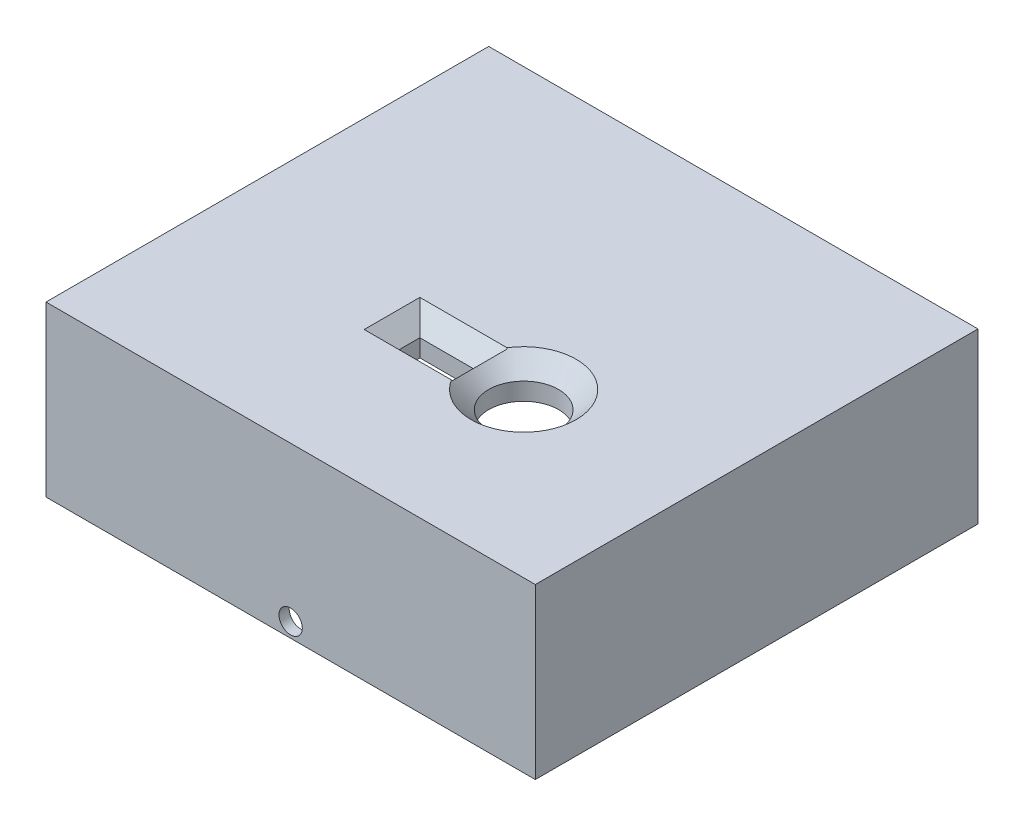
ISO-10303-21;
HEADER;
FILE_DESCRIPTION(('STEP AP214'),'2;1');
FILE_NAME('part.step','',(''),(''),'','','');
FILE_SCHEMA(('AUTOMOTIVE_DESIGN { 1 0 10303 214 1 1 1 1 }'));
ENDSEC;
DATA;
#1=APPLICATION_CONTEXT('core data for automotive mechanical design processes');
#2=APPLICATION_PROTOCOL_DEFINITION('international standard','automotive_design',2000,#1);
#3=PRODUCT_CONTEXT('',#1,'mechanical');
#4=PRODUCT('Part','Part','',(#3));
#5=PRODUCT_RELATED_PRODUCT_CATEGORY('part','',(#4));
#6=PRODUCT_DEFINITION_FORMATION('','',#4);
#7=PRODUCT_DEFINITION_CONTEXT('part definition',#1,'design');
#8=PRODUCT_DEFINITION('design','',#6,#7);
#9=PRODUCT_DEFINITION_SHAPE('','',#8);
#10=(LENGTH_UNIT() NAMED_UNIT(*) SI_UNIT(.MILLI.,.METRE.));
#11=(NAMED_UNIT(*) PLANE_ANGLE_UNIT() SI_UNIT($,.RADIAN.));
#12=(NAMED_UNIT(*) SI_UNIT($,.STERADIAN.) SOLID_ANGLE_UNIT());
#13=UNCERTAINTY_MEASURE_WITH_UNIT(LENGTH_MEASURE(1.E-05),#10,'distance_accuracy_value','');
#14=(GEOMETRIC_REPRESENTATION_CONTEXT(3) GLOBAL_UNCERTAINTY_ASSIGNED_CONTEXT((#13)) GLOBAL_UNIT_ASSIGNED_CONTEXT((#10,
#11,#12)) REPRESENTATION_CONTEXT('',''));
#15=CARTESIAN_POINT('',(0.,0.,0.));
#16=DIRECTION('',(0.,0.,1.));
#17=DIRECTION('',(1.,0.,0.));
#18=AXIS2_PLACEMENT_3D('',#15,#16,#17);
#19=CARTESIAN_POINT('',(0.,17.2171639290973,0.));
#20=DIRECTION('',(0.,1.,0.));
#21=DIRECTION('',(0.,0.,1.));
#22=AXIS2_PLACEMENT_3D('',#19,#20,#21);
#23=PLANE('',#22);
#24=DIRECTION('',(0.,0.,-1.));
#25=VECTOR('',#24,1.);
#26=CARTESIAN_POINT('',(-31.7595631136323,17.2171639290973,40.0823430767128));
#27=LINE('',#26,#25);
#28=CARTESIAN_POINT('',(-31.7595631136323,17.2171639290973,38.0823430767128));
#29=VERTEX_POINT('',#28);
#30=CARTESIAN_POINT('',(-31.7595631136323,17.2171639290973,26.2063778767126));
#31=VERTEX_POINT('',#30);
#32=EDGE_CURVE('E319',#29,#31,#27,.T.);
#33=ORIENTED_EDGE('',*,*,#32,.T.);
#34=DIRECTION('',(1.,0.,0.));
#35=VECTOR('',#34,1.);
#36=CARTESIAN_POINT('',(-30.0095631136323,17.2171639290973,26.2063778767126));
#37=LINE('',#36,#35);
#38=CARTESIAN_POINT('',(-30.0095631136323,17.2171639290973,26.2063778767126));
#39=VERTEX_POINT('',#38);
#40=EDGE_CURVE('E1033',#31,#39,#37,.T.);
#41=ORIENTED_EDGE('',*,*,#40,.T.);
#42=DIRECTION('',(0.,0.,-1.));
#43=VECTOR('',#42,1.);
#44=CARTESIAN_POINT('',(-30.0095631136323,17.2171639290973,52.3943564767127));
#45=LINE('',#44,#43);
#46=CARTESIAN_POINT('',(-30.0095631136323,17.2171639290973,-20.1056435232873));
#47=VERTEX_POINT('',#46);
#48=EDGE_CURVE('E373',#39,#47,#45,.T.);
#49=ORIENTED_EDGE('',*,*,#48,.T.);
#50=DIRECTION('',(1.,0.,0.));
#51=VECTOR('',#50,1.);
#52=CARTESIAN_POINT('',(-30.0095631136323,17.2171639290973,-20.1056435232873));
#53=LINE('',#52,#51);
#54=CARTESIAN_POINT('',(50.4902968863677,17.2171639290973,-20.1056435232873));
#55=VERTEX_POINT('',#54);
#56=EDGE_CURVE('E377',#47,#55,#53,.T.);
#57=ORIENTED_EDGE('',*,*,#56,.T.);
#58=DIRECTION('',(0.,0.,1.));
#59=VECTOR('',#58,1.);
#60=CARTESIAN_POINT('',(50.4902968863677,17.2171639290973,52.3943564767127));
#61=LINE('',#60,#59);
#62=CARTESIAN_POINT('',(50.4902968863677,17.2171639290973,52.3943564767127));
#63=VERTEX_POINT('',#62);
#64=EDGE_CURVE('E381',#55,#63,#61,.T.);
#65=ORIENTED_EDGE('',*,*,#64,.T.);
#66=DIRECTION('',(-1.,0.,0.));
#67=VECTOR('',#66,1.);
#68=CARTESIAN_POINT('',(-30.0095631136323,17.2171639290973,52.3943564767127));
#69=LINE('',#68,#67);
#70=CARTESIAN_POINT('',(-30.0095631136323,17.2171639290973,52.3943564767127));
#71=VERTEX_POINT('',#70);
#72=EDGE_CURVE('E369',#63,#71,#69,.T.);
#73=ORIENTED_EDGE('',*,*,#72,.T.);
#74=CARTESIAN_POINT('',(-30.0095631136323,17.2171639290973,38.0823430767128));
#75=VERTEX_POINT('',#74);
#76=EDGE_CURVE('E374',#71,#75,#45,.T.);
#77=ORIENTED_EDGE('',*,*,#76,.T.);
#78=DIRECTION('',(-1.,0.,0.));
#79=VECTOR('',#78,1.);
#80=CARTESIAN_POINT('',(-31.7595631136323,17.2171639290973,38.0823430767128));
#81=LINE('',#80,#79);
#82=EDGE_CURVE('E1030',#75,#29,#81,.T.);
#83=ORIENTED_EDGE('',*,*,#82,.T.);
#84=EDGE_LOOP('',(#33,#41,#49,#57,#65,#73,#77,#83));
#85=FACE_BOUND('',#84,.T.);
#86=CARTESIAN_POINT('',(22.2403298776787,17.2171639290973,26.1443623216558));
#87=DIRECTION('',(0.,-1.,0.));
#88=DIRECTION('',(0.,0.,-1.));
#89=AXIS2_PLACEMENT_3D('',#86,#87,#88);
#90=CIRCLE('',#89,8.);
#91=CARTESIAN_POINT('',(20.6486427168637,17.2171639290973,18.3043028842473));
#92=VERTEX_POINT('',#91);
#93=CARTESIAN_POINT('',(20.6486025662581,17.2171639290973,33.9844136075899));
#94=VERTEX_POINT('',#93);
#95=EDGE_CURVE('E257',#92,#94,#90,.T.);
#96=ORIENTED_EDGE('',*,*,#95,.F.);
#97=DIRECTION('',(0.980007429676051,0.,-0.198960895101874));
#98=VECTOR('',#97,1.);
#99=CARTESIAN_POINT('',(0.64039748636765,17.2171639290973,22.3663724767128));
#100=LINE('',#99,#98);
#101=CARTESIAN_POINT('',(0.64039748636765,17.2171639290973,22.3663724767128));
#102=VERTEX_POINT('',#101);
#103=EDGE_CURVE('E263',#102,#92,#100,.T.);
#104=ORIENTED_EDGE('',*,*,#103,.F.);
#105=DIRECTION('',(0.,0.,-1.));
#106=VECTOR('',#105,1.);
#107=CARTESIAN_POINT('',(0.64039748636765,17.2171639290973,29.9222454767128));
#108=LINE('',#107,#106);
#109=CARTESIAN_POINT('',(0.64039748636765,17.2171639290973,29.9222454767128));
#110=VERTEX_POINT('',#109);
#111=EDGE_CURVE('E280',#110,#102,#108,.T.);
#112=ORIENTED_EDGE('',*,*,#111,.F.);
#113=DIRECTION('',(-0.980006410741771,0.,-0.198965913927564));
#114=VECTOR('',#113,1.);
#115=CARTESIAN_POINT('',(0.64039748636765,17.2171639290973,29.9222454767128));
#116=LINE('',#115,#114);
#117=EDGE_CURVE('E276',#94,#110,#116,.T.);
#118=ORIENTED_EDGE('',*,*,#117,.F.);
#119=EDGE_LOOP('',(#96,#104,#112,#118));
#120=FACE_BOUND('',#119,.T.);
#121=ADVANCED_FACE('F47',(#85,#120),#23,.F.);
#122=CARTESIAN_POINT('',(0.,19.2171639290973,0.));
#123=DIRECTION('',(0.,1.,0.));
#124=DIRECTION('',(0.,0.,1.));
#125=AXIS2_PLACEMENT_3D('',#122,#123,#124);
#126=PLANE('',#125);
#127=DIRECTION('',(-1.,0.,0.));
#128=VECTOR('',#127,1.);
#129=CARTESIAN_POINT('',(0.,19.2171639290973,30.9222454767128));
#130=LINE('',#129,#128);
#131=CARTESIAN_POINT('',(14.6132837550554,19.2171639290973,30.9222454767128));
#132=VERTEX_POINT('',#131);
#133=CARTESIAN_POINT('',(-0.359602513632352,19.2171639290973,30.9222454767128));
#134=VERTEX_POINT('',#133);
#135=EDGE_CURVE('E461',#132,#134,#130,.T.);
#136=ORIENTED_EDGE('',*,*,#135,.T.);
#137=DIRECTION('',(0.,0.,-1.));
#138=VECTOR('',#137,1.);
#139=CARTESIAN_POINT('',(-0.359602513632352,19.2171639290973,0.));
#140=LINE('',#139,#138);
#141=CARTESIAN_POINT('',(-0.359602513632352,19.2171639290973,21.3663724767128));
#142=VERTEX_POINT('',#141);
#143=EDGE_CURVE('E467',#134,#142,#140,.T.);
#144=ORIENTED_EDGE('',*,*,#143,.T.);
#145=DIRECTION('',(1.,0.,0.));
#146=VECTOR('',#145,1.);
#147=CARTESIAN_POINT('',(0.,19.2171639290973,21.3663724767128));
#148=LINE('',#147,#146);
#149=CARTESIAN_POINT('',(14.613350590856,19.2171639290973,21.3663724767128));
#150=VERTEX_POINT('',#149);
#151=EDGE_CURVE('E464',#142,#150,#148,.T.);
#152=ORIENTED_EDGE('',*,*,#151,.T.);
#153=CARTESIAN_POINT('',(22.2403298776787,19.2171639290973,26.1443623216558));
#154=DIRECTION('',(0.,1.,0.));
#155=DIRECTION('',(0.,0.,1.));
#156=AXIS2_PLACEMENT_3D('',#153,#154,#155);
#157=CIRCLE('',#156,8.99999999999998);
#158=CARTESIAN_POINT('',(22.2403298776787,19.2171639290973,35.1443623216557));
#159=VERTEX_POINT('',#158);
#160=EDGE_CURVE('E458',#150,#159,#157,.F.);
#161=ORIENTED_EDGE('',*,*,#160,.T.);
#162=CARTESIAN_POINT('',(22.2403298776787,19.2171639290973,26.1443623216558));
#163=DIRECTION('',(0.,1.,0.));
#164=DIRECTION('',(0.,0.,1.));
#165=AXIS2_PLACEMENT_3D('',#162,#163,#164);
#166=CIRCLE('',#165,8.99999999999998);
#167=EDGE_CURVE('E455',#159,#132,#166,.F.);
#168=ORIENTED_EDGE('',*,*,#167,.T.);
#169=EDGE_LOOP('',(#136,#144,#152,#161,#168));
#170=FACE_BOUND('',#169,.T.);
#171=DIRECTION('',(0.,0.,1.));
#172=VECTOR('',#171,1.);
#173=CARTESIAN_POINT('',(-31.7595631136323,19.2171639290973,-21.8556435232873));
#174=LINE('',#173,#172);
#175=CARTESIAN_POINT('',(-31.7595631136323,19.2171639290973,-21.8556435232873));
#176=VERTEX_POINT('',#175);
#177=CARTESIAN_POINT('',(-31.7595631136323,19.2171639290973,54.1443564767127));
#178=VERTEX_POINT('',#177);
#179=EDGE_CURVE('E231',#176,#178,#174,.T.);
#180=ORIENTED_EDGE('',*,*,#179,.T.);
#181=DIRECTION('',(1.,0.,0.));
#182=VECTOR('',#181,1.);
#183=CARTESIAN_POINT('',(-31.7595631136323,19.2171639290973,54.1443564767127));
#184=LINE('',#183,#182);
#185=CARTESIAN_POINT('',(52.2402968863677,19.2171639290973,54.1443564767127));
#186=VERTEX_POINT('',#185);
#187=EDGE_CURVE('E414',#178,#186,#184,.T.);
#188=ORIENTED_EDGE('',*,*,#187,.T.);
#189=DIRECTION('',(0.,0.,-1.));
#190=VECTOR('',#189,1.);
#191=CARTESIAN_POINT('',(52.2402968863677,19.2171639290973,-21.8556435232873));
#192=LINE('',#191,#190);
#193=CARTESIAN_POINT('',(52.2402968863677,19.2171639290973,-21.8556435232873));
#194=VERTEX_POINT('',#193);
#195=EDGE_CURVE('E417',#186,#194,#192,.T.);
#196=ORIENTED_EDGE('',*,*,#195,.T.);
#197=DIRECTION('',(-1.,0.,0.));
#198=VECTOR('',#197,1.);
#199=CARTESIAN_POINT('',(-31.7595631136323,19.2171639290973,-21.8556435232873));
#200=LINE('',#199,#198);
#201=EDGE_CURVE('E420',#194,#176,#200,.T.);
#202=ORIENTED_EDGE('',*,*,#201,.T.);
#203=EDGE_LOOP('',(#180,#188,#196,#202));
#204=FACE_BOUND('',#203,.T.);
#205=ADVANCED_FACE('F574',(#170,#204),#126,.T.);
#206=CARTESIAN_POINT('',(-31.7595631136323,19.2171639290973,-21.8556435232873));
#207=DIRECTION('',(1.,0.,0.));
#208=DIRECTION('',(0.,0.,-1.));
#209=AXIS2_PLACEMENT_3D('',#206,#207,#208);
#210=PLANE('',#209);
#211=ORIENTED_EDGE('',*,*,#32,.F.);
#212=DIRECTION('',(0.,0.707106781186546,-0.70710678118655));
#213=VECTOR('',#212,1.);
#214=CARTESIAN_POINT('',(-31.7595631136323,48.1861572290973,7.1133497767126));
#215=LINE('',#214,#213);
#216=CARTESIAN_POINT('',(-31.7595631136323,15.2171639290973,40.0823430767128));
#217=VERTEX_POINT('',#216);
#218=EDGE_CURVE('E57',#29,#217,#215,.F.);
#219=ORIENTED_EDGE('',*,*,#218,.T.);
#220=DIRECTION('',(0.,1.,0.));
#221=VECTOR('',#220,1.);
#222=CARTESIAN_POINT('',(-31.7595631136323,17.2171639290973,40.0823430767128));
#223=LINE('',#222,#221);
#224=CARTESIAN_POINT('',(-31.7595631136323,9.71716392909726,40.0823430767128));
#225=VERTEX_POINT('',#224);
#226=EDGE_CURVE('E316',#225,#217,#223,.T.);
#227=ORIENTED_EDGE('',*,*,#226,.F.);
#228=DIRECTION('',(0.,0.,1.));
#229=VECTOR('',#228,1.);
#230=CARTESIAN_POINT('',(-31.7595631136323,9.71716392909726,40.0823430767128));
#231=LINE('',#230,#229);
#232=CARTESIAN_POINT('',(-31.7595631136323,9.71716392909726,24.2063778767126));
#233=VERTEX_POINT('',#232);
#234=EDGE_CURVE('E326',#233,#225,#231,.T.);
#235=ORIENTED_EDGE('',*,*,#234,.F.);
#236=DIRECTION('',(0.,-1.,0.));
#237=VECTOR('',#236,1.);
#238=CARTESIAN_POINT('',(-31.7595631136323,17.2171639290973,24.2063778767126));
#239=LINE('',#238,#237);
#240=CARTESIAN_POINT('',(-31.7595631136323,15.2171639290972,24.2063778767126));
#241=VERTEX_POINT('',#240);
#242=EDGE_CURVE('E323',#241,#233,#239,.T.);
#243=ORIENTED_EDGE('',*,*,#242,.F.);
#244=DIRECTION('',(0.,-0.70710678118655,-0.707106781186545));
#245=VECTOR('',#244,1.);
#246=CARTESIAN_POINT('',(-31.7595631136323,-5.81384677090268,3.17536717671284));
#247=LINE('',#246,#245);
#248=EDGE_CURVE('E1028',#241,#31,#247,.F.);
#249=ORIENTED_EDGE('',*,*,#248,.T.);
#250=EDGE_LOOP('',(#211,#219,#227,#235,#243,#249));
#251=FACE_BOUND('',#250,.T.);
#252=CARTESIAN_POINT('',(-31.7595631136323,11.2171639290973,-6.85564352328728));
#253=DIRECTION('',(-1.,0.,0.));
#254=DIRECTION('',(0.,0.,1.));
#255=AXIS2_PLACEMENT_3D('',#252,#253,#254);
#256=CIRCLE('',#255,4.);
#257=CARTESIAN_POINT('',(-31.7595631136323,11.2171639290973,-2.85564352328728));
#258=VERTEX_POINT('',#257);
#259=EDGE_CURVE('E315',#258,#258,#256,.T.);
#260=ORIENTED_EDGE('',*,*,#259,.F.);
#261=EDGE_LOOP('',(#260));
#262=FACE_BOUND('',#261,.T.);
#263=DIRECTION('',(0.,-1.,0.));
#264=VECTOR('',#263,1.);
#265=CARTESIAN_POINT('',(-31.7595631136323,19.2171639290973,-21.8556435232873));
#266=LINE('',#265,#264);
#267=CARTESIAN_POINT('',(-31.7595631136323,-9.78283607090269,-21.8556435232873));
#268=VERTEX_POINT('',#267);
#269=EDGE_CURVE('E423',#176,#268,#266,.T.);
#270=ORIENTED_EDGE('',*,*,#269,.T.);
#271=DIRECTION('',(0.,0.,-1.));
#272=VECTOR('',#271,1.);
#273=CARTESIAN_POINT('',(-31.7595631136323,-9.78283607090269,54.1443564767127));
#274=LINE('',#273,#272);
#275=CARTESIAN_POINT('',(-31.7595631136323,-9.78283607090269,54.1443564767127));
#276=VERTEX_POINT('',#275);
#277=EDGE_CURVE('E365',#276,#268,#274,.T.);
#278=ORIENTED_EDGE('',*,*,#277,.F.);
#279=DIRECTION('',(0.,-1.,0.));
#280=VECTOR('',#279,1.);
#281=CARTESIAN_POINT('',(-31.7595631136323,19.2171639290973,54.1443564767127));
#282=LINE('',#281,#280);
#283=EDGE_CURVE('E432',#178,#276,#282,.T.);
#284=ORIENTED_EDGE('',*,*,#283,.F.);
#285=ORIENTED_EDGE('',*,*,#179,.F.);
#286=EDGE_LOOP('',(#270,#278,#284,#285));
#287=FACE_BOUND('',#286,.T.);
#288=ADVANCED_FACE('F580',(#251,#262,#287),#210,.F.);
#289=CARTESIAN_POINT('',(-31.7595631136323,19.2171639290973,54.1443564767127));
#290=DIRECTION('',(0.,0.,-1.));
#291=DIRECTION('',(-1.,0.,0.));
#292=AXIS2_PLACEMENT_3D('',#289,#290,#291);
#293=PLANE('',#292);
#294=CARTESIAN_POINT('',(10.2403668863677,-7.2828360709027,54.1443564767127));
#295=DIRECTION('',(0.,0.,1.));
#296=DIRECTION('',(1.,0.,0.));
#297=AXIS2_PLACEMENT_3D('',#294,#295,#296);
#298=CIRCLE('',#297,2.);
#299=CARTESIAN_POINT('',(12.2403668863677,-7.2828360709027,54.1443564767127));
#300=VERTEX_POINT('',#299);
#301=EDGE_CURVE('E302',#300,#300,#298,.T.);
#302=ORIENTED_EDGE('',*,*,#301,.F.);
#303=EDGE_LOOP('',(#302));
#304=FACE_BOUND('',#303,.T.);
#305=ORIENTED_EDGE('',*,*,#283,.T.);
#306=DIRECTION('',(-1.,0.,0.));
#307=VECTOR('',#306,1.);
#308=CARTESIAN_POINT('',(-31.7595631136323,-9.78283607090269,54.1443564767127));
#309=LINE('',#308,#307);
#310=CARTESIAN_POINT('',(52.2402968863677,-9.78283607090269,54.1443564767127));
#311=VERTEX_POINT('',#310);
#312=EDGE_CURVE('E353',#311,#276,#309,.T.);
#313=ORIENTED_EDGE('',*,*,#312,.F.);
#314=DIRECTION('',(0.,-1.,0.));
#315=VECTOR('',#314,1.);
#316=CARTESIAN_POINT('',(52.2402968863677,19.2171639290973,54.1443564767127));
#317=LINE('',#316,#315);
#318=EDGE_CURVE('E429',#186,#311,#317,.T.);
#319=ORIENTED_EDGE('',*,*,#318,.F.);
#320=ORIENTED_EDGE('',*,*,#187,.F.);
#321=EDGE_LOOP('',(#305,#313,#319,#320));
#322=FACE_BOUND('',#321,.T.);
#323=ADVANCED_FACE('F593',(#304,#322),#293,.F.);
#324=CARTESIAN_POINT('',(52.2402968863677,19.2171639290973,-21.8556435232873));
#325=DIRECTION('',(-1.,0.,0.));
#326=DIRECTION('',(0.,0.,1.));
#327=AXIS2_PLACEMENT_3D('',#324,#325,#326);
#328=PLANE('',#327);
#329=ORIENTED_EDGE('',*,*,#318,.T.);
#330=DIRECTION('',(0.,0.,1.));
#331=VECTOR('',#330,1.);
#332=CARTESIAN_POINT('',(52.2402968863677,-9.78283607090269,54.1443564767127));
#333=LINE('',#332,#331);
#334=CARTESIAN_POINT('',(52.2402968863677,-9.78283607090269,-21.8556435232873));
#335=VERTEX_POINT('',#334);
#336=EDGE_CURVE('E357',#335,#311,#333,.T.);
#337=ORIENTED_EDGE('',*,*,#336,.F.);
#338=DIRECTION('',(0.,-1.,0.));
#339=VECTOR('',#338,1.);
#340=CARTESIAN_POINT('',(52.2402968863677,19.2171639290973,-21.8556435232873));
#341=LINE('',#340,#339);
#342=EDGE_CURVE('E426',#194,#335,#341,.T.);
#343=ORIENTED_EDGE('',*,*,#342,.F.);
#344=ORIENTED_EDGE('',*,*,#195,.F.);
#345=EDGE_LOOP('',(#329,#337,#343,#344));
#346=FACE_BOUND('',#345,.T.);
#347=ADVANCED_FACE('F589',(#346),#328,.F.);
#348=CARTESIAN_POINT('',(-31.7595631136323,19.2171639290973,-21.8556435232873));
#349=DIRECTION('',(0.,0.,1.));
#350=DIRECTION('',(1.,0.,0.));
#351=AXIS2_PLACEMENT_3D('',#348,#349,#350);
#352=PLANE('',#351);
#353=CARTESIAN_POINT('',(10.2403668863677,-7.2828360709027,-21.8556435232873));
#354=DIRECTION('',(0.,0.,1.));
#355=DIRECTION('',(1.,0.,0.));
#356=AXIS2_PLACEMENT_3D('',#353,#354,#355);
#357=CIRCLE('',#356,2.);
#358=CARTESIAN_POINT('',(12.2403668863677,-7.2828360709027,-21.8556435232873));
#359=VERTEX_POINT('',#358);
#360=EDGE_CURVE('E303',#359,#359,#357,.T.);
#361=ORIENTED_EDGE('',*,*,#360,.T.);
#362=EDGE_LOOP('',(#361));
#363=FACE_BOUND('',#362,.T.);
#364=ORIENTED_EDGE('',*,*,#342,.T.);
#365=DIRECTION('',(1.,0.,0.));
#366=VECTOR('',#365,1.);
#367=CARTESIAN_POINT('',(-31.7595631136323,-9.78283607090269,-21.8556435232873));
#368=LINE('',#367,#366);
#369=EDGE_CURVE('E361',#268,#335,#368,.T.);
#370=ORIENTED_EDGE('',*,*,#369,.F.);
#371=ORIENTED_EDGE('',*,*,#269,.F.);
#372=ORIENTED_EDGE('',*,*,#201,.F.);
#373=EDGE_LOOP('',(#364,#370,#371,#372));
#374=FACE_BOUND('',#373,.T.);
#375=ADVANCED_FACE('F586',(#363,#374),#352,.F.);
#376=CARTESIAN_POINT('',(11.8123628863677,19.2171639290973,24.3663724767128));
#377=DIRECTION('',(-1.,0.,0.));
#378=DIRECTION('',(0.,0.,1.));
#379=AXIS2_PLACEMENT_3D('',#376,#377,#378);
#380=PLANE('',#379);
#381=DIRECTION('',(0.,-1.,0.));
#382=VECTOR('',#381,1.);
#383=CARTESIAN_POINT('',(11.8123628863677,19.2171639290973,27.9222454767127));
#384=LINE('',#383,#382);
#385=CARTESIAN_POINT('',(11.8123628863677,16.2171639290973,27.9222454767127));
#386=VERTEX_POINT('',#385);
#387=CARTESIAN_POINT('',(11.8123628863677,13.2171639290973,27.9222454767127));
#388=VERTEX_POINT('',#387);
#389=EDGE_CURVE('E403',#386,#388,#384,.T.);
#390=ORIENTED_EDGE('',*,*,#389,.F.);
#391=DIRECTION('',(0.,0.,-1.));
#392=VECTOR('',#391,1.);
#393=CARTESIAN_POINT('',(11.8123628863677,16.2171639290973,24.3663724767128));
#394=LINE('',#393,#392);
#395=CARTESIAN_POINT('',(11.8123628863677,16.2171639290973,24.3663724767128));
#396=VERTEX_POINT('',#395);
#397=EDGE_CURVE('E227',#386,#396,#394,.T.);
#398=ORIENTED_EDGE('',*,*,#397,.T.);
#399=DIRECTION('',(0.,-1.,0.));
#400=VECTOR('',#399,1.);
#401=CARTESIAN_POINT('',(11.8123628863677,19.2171639290973,24.3663724767128));
#402=LINE('',#401,#400);
#403=CARTESIAN_POINT('',(11.8123628863677,13.2171639290973,24.3663724767128));
#404=VERTEX_POINT('',#403);
#405=EDGE_CURVE('E219',#396,#404,#402,.T.);
#406=ORIENTED_EDGE('',*,*,#405,.T.);
#407=DIRECTION('',(0.,0.,1.));
#408=VECTOR('',#407,1.);
#409=CARTESIAN_POINT('',(11.8123628863677,13.2171639290973,27.9222454767127));
#410=LINE('',#409,#408);
#411=EDGE_CURVE('E224',#404,#388,#410,.T.);
#412=ORIENTED_EDGE('',*,*,#411,.T.);
#413=EDGE_LOOP('',(#390,#398,#406,#412));
#414=FACE_BOUND('',#413,.T.);
#415=ADVANCED_FACE('F222',(#414),#380,.T.);
#416=CARTESIAN_POINT('',(11.8123628863677,19.2171639290973,24.3663724767128));
#417=DIRECTION('',(0.,0.,1.));
#418=DIRECTION('',(1.,0.,0.));
#419=AXIS2_PLACEMENT_3D('',#416,#417,#418);
#420=PLANE('',#419);
#421=ORIENTED_EDGE('',*,*,#405,.F.);
#422=DIRECTION('',(-1.,0.,0.));
#423=VECTOR('',#422,1.);
#424=CARTESIAN_POINT('',(11.8123628863677,16.2171639290973,24.3663724767128));
#425=LINE('',#424,#423);
#426=CARTESIAN_POINT('',(2.64039748636765,16.2171639290973,24.3663724767128));
#427=VERTEX_POINT('',#426);
#428=EDGE_CURVE('E471',#396,#427,#425,.T.);
#429=ORIENTED_EDGE('',*,*,#428,.T.);
#430=DIRECTION('',(0.,-1.,0.));
#431=VECTOR('',#430,1.);
#432=CARTESIAN_POINT('',(2.64039748636765,19.2171639290973,24.3663724767128));
#433=LINE('',#432,#431);
#434=CARTESIAN_POINT('',(2.64039748636765,13.2171639290973,24.3663724767128));
#435=VERTEX_POINT('',#434);
#436=EDGE_CURVE('E232',#427,#435,#433,.T.);
#437=ORIENTED_EDGE('',*,*,#436,.T.);
#438=DIRECTION('',(1.,0.,0.));
#439=VECTOR('',#438,1.);
#440=CARTESIAN_POINT('',(11.8123628863677,13.2171639290973,24.3663724767128));
#441=LINE('',#440,#439);
#442=EDGE_CURVE('E235',#435,#404,#441,.T.);
#443=ORIENTED_EDGE('',*,*,#442,.T.);
#444=EDGE_LOOP('',(#421,#429,#437,#443));
#445=FACE_BOUND('',#444,.T.);
#446=ADVANCED_FACE('F236',(#445),#420,.T.);
#447=CARTESIAN_POINT('',(2.64039748636765,19.2171639290973,24.3663724767128));
#448=DIRECTION('',(1.,0.,0.));
#449=DIRECTION('',(0.,0.,-1.));
#450=AXIS2_PLACEMENT_3D('',#447,#448,#449);
#451=PLANE('',#450);
#452=ORIENTED_EDGE('',*,*,#436,.F.);
#453=DIRECTION('',(0.,0.,1.));
#454=VECTOR('',#453,1.);
#455=CARTESIAN_POINT('',(2.64039748636765,16.2171639290973,24.3663724767128));
#456=LINE('',#455,#454);
#457=CARTESIAN_POINT('',(2.64039748636765,16.2171639290973,27.9222454767127));
#458=VERTEX_POINT('',#457);
#459=EDGE_CURVE('E448',#427,#458,#456,.T.);
#460=ORIENTED_EDGE('',*,*,#459,.T.);
#461=DIRECTION('',(0.,-1.,0.));
#462=VECTOR('',#461,1.);
#463=CARTESIAN_POINT('',(2.64039748636765,19.2171639290973,27.9222454767127));
#464=LINE('',#463,#462);
#465=CARTESIAN_POINT('',(2.64039748636765,13.2171639290973,27.9222454767127));
#466=VERTEX_POINT('',#465);
#467=EDGE_CURVE('E406',#458,#466,#464,.T.);
#468=ORIENTED_EDGE('',*,*,#467,.T.);
#469=DIRECTION('',(0.,0.,-1.));
#470=VECTOR('',#469,1.);
#471=CARTESIAN_POINT('',(2.64039748636765,13.2171639290973,24.3663724767128));
#472=LINE('',#471,#470);
#473=EDGE_CURVE('E251',#466,#435,#472,.T.);
#474=ORIENTED_EDGE('',*,*,#473,.T.);
#475=EDGE_LOOP('',(#452,#460,#468,#474));
#476=FACE_BOUND('',#475,.T.);
#477=ADVANCED_FACE('F659',(#476),#451,.T.);
#478=CARTESIAN_POINT('',(11.8123628863677,19.2171639290973,27.9222454767127));
#479=DIRECTION('',(0.,0.,-1.));
#480=DIRECTION('',(-1.,0.,0.));
#481=AXIS2_PLACEMENT_3D('',#478,#479,#480);
#482=PLANE('',#481);
#483=ORIENTED_EDGE('',*,*,#467,.F.);
#484=DIRECTION('',(1.,0.,0.));
#485=VECTOR('',#484,1.);
#486=CARTESIAN_POINT('',(11.8123628863677,16.2171639290973,27.9222454767127));
#487=LINE('',#486,#485);
#488=EDGE_CURVE('E476',#458,#386,#487,.T.);
#489=ORIENTED_EDGE('',*,*,#488,.T.);
#490=ORIENTED_EDGE('',*,*,#389,.T.);
#491=DIRECTION('',(-1.,0.,0.));
#492=VECTOR('',#491,1.);
#493=CARTESIAN_POINT('',(2.64039748636765,13.2171639290973,27.9222454767127));
#494=LINE('',#493,#492);
#495=EDGE_CURVE('E247',#388,#466,#494,.T.);
#496=ORIENTED_EDGE('',*,*,#495,.T.);
#497=EDGE_LOOP('',(#483,#489,#490,#496));
#498=FACE_BOUND('',#497,.T.);
#499=ADVANCED_FACE('F655',(#498),#482,.T.);
#500=CARTESIAN_POINT('',(22.2403298776787,19.2171639290973,26.1443623216558));
#501=DIRECTION('',(0.,-1.,0.));
#502=DIRECTION('',(0.,0.,-1.));
#503=AXIS2_PLACEMENT_3D('',#500,#501,#502);
#504=CYLINDRICAL_SURFACE('',#503,6.);
#505=CARTESIAN_POINT('',(22.2403298776787,16.2171639290973,26.1443623216558));
#506=DIRECTION('',(0.,1.,0.));
#507=DIRECTION('',(0.,0.,1.));
#508=AXIS2_PLACEMENT_3D('',#505,#506,#507);
#509=CIRCLE('',#508,6.);
#510=CARTESIAN_POINT('',(22.2403298776787,16.2171639290973,32.1443623216558));
#511=VERTEX_POINT('',#510);
#512=EDGE_CURVE('E479',#511,#511,#509,.T.);
#513=ORIENTED_EDGE('',*,*,#512,.T.);
#514=EDGE_LOOP('',(#513));
#515=FACE_BOUND('',#514,.T.);
#516=CARTESIAN_POINT('',(22.2403298776787,13.2171639290973,26.1443623216558));
#517=DIRECTION('',(0.,-1.,0.));
#518=DIRECTION('',(0.,0.,-1.));
#519=AXIS2_PLACEMENT_3D('',#516,#517,#518);
#520=CIRCLE('',#519,6.);
#521=CARTESIAN_POINT('',(22.2403298776787,13.2171639290973,20.1443623216558));
#522=VERTEX_POINT('',#521);
#523=EDGE_CURVE('E242',#522,#522,#520,.T.);
#524=ORIENTED_EDGE('',*,*,#523,.T.);
#525=EDGE_LOOP('',(#524));
#526=FACE_BOUND('',#525,.T.);
#527=ADVANCED_FACE('F645',(#515,#526),#504,.F.);
#528=CARTESIAN_POINT('',(50.4902968863677,-123.061150323983,52.3943564767127));
#529=DIRECTION('',(-1.,0.,0.));
#530=DIRECTION('',(0.,0.,1.));
#531=AXIS2_PLACEMENT_3D('',#528,#529,#530);
#532=PLANE('',#531);
#533=DIRECTION('',(0.,1.,0.));
#534=VECTOR('',#533,1.);
#535=CARTESIAN_POINT('',(50.4902968863677,-123.061150323983,-20.1056435232873));
#536=LINE('',#535,#534);
#537=CARTESIAN_POINT('',(50.4902968863677,-9.78283607090269,-20.1056435232873));
#538=VERTEX_POINT('',#537);
#539=EDGE_CURVE('E388',#538,#55,#536,.T.);
#540=ORIENTED_EDGE('',*,*,#539,.F.);
#541=DIRECTION('',(0.,0.,1.));
#542=VECTOR('',#541,1.);
#543=CARTESIAN_POINT('',(50.4902968863677,-9.78283607090269,52.3943564767127));
#544=LINE('',#543,#542);
#545=CARTESIAN_POINT('',(50.4902968863677,-9.78283607090269,52.3943564767127));
#546=VERTEX_POINT('',#545);
#547=EDGE_CURVE('E399',#538,#546,#544,.T.);
#548=ORIENTED_EDGE('',*,*,#547,.T.);
#549=DIRECTION('',(0.,1.,0.));
#550=VECTOR('',#549,1.);
#551=CARTESIAN_POINT('',(50.4902968863677,-123.061150323983,52.3943564767127));
#552=LINE('',#551,#550);
#553=EDGE_CURVE('E385',#546,#63,#552,.T.);
#554=ORIENTED_EDGE('',*,*,#553,.T.);
#555=ORIENTED_EDGE('',*,*,#64,.F.);
#556=EDGE_LOOP('',(#540,#548,#554,#555));
#557=FACE_BOUND('',#556,.T.);
#558=ADVANCED_FACE('F641',(#557),#532,.T.);
#559=CARTESIAN_POINT('',(-30.0095631136323,-123.061150323983,-20.1056435232873));
#560=DIRECTION('',(0.,0.,1.));
#561=DIRECTION('',(1.,0.,0.));
#562=AXIS2_PLACEMENT_3D('',#559,#560,#561);
#563=PLANE('',#562);
#564=CARTESIAN_POINT('',(10.2403668863677,-7.2828360709027,-20.1056435232873));
#565=DIRECTION('',(0.,0.,1.));
#566=DIRECTION('',(1.,0.,0.));
#567=AXIS2_PLACEMENT_3D('',#564,#565,#566);
#568=CIRCLE('',#567,2.);
#569=CARTESIAN_POINT('',(12.2403668863677,-7.2828360709027,-20.1056435232873));
#570=VERTEX_POINT('',#569);
#571=EDGE_CURVE('E311',#570,#570,#568,.T.);
#572=ORIENTED_EDGE('',*,*,#571,.F.);
#573=EDGE_LOOP('',(#572));
#574=FACE_BOUND('',#573,.T.);
#575=DIRECTION('',(0.,1.,0.));
#576=VECTOR('',#575,1.);
#577=CARTESIAN_POINT('',(-30.0095631136323,-123.061150323983,-20.1056435232873));
#578=LINE('',#577,#576);
#579=CARTESIAN_POINT('',(-30.0095631136323,-9.78283607090269,-20.1056435232873));
#580=VERTEX_POINT('',#579);
#581=EDGE_CURVE('E391',#580,#47,#578,.T.);
#582=ORIENTED_EDGE('',*,*,#581,.F.);
#583=DIRECTION('',(1.,0.,0.));
#584=VECTOR('',#583,1.);
#585=CARTESIAN_POINT('',(-30.0095631136323,-9.78283607090269,-20.1056435232873));
#586=LINE('',#585,#584);
#587=EDGE_CURVE('E341',#580,#538,#586,.T.);
#588=ORIENTED_EDGE('',*,*,#587,.T.);
#589=ORIENTED_EDGE('',*,*,#539,.T.);
#590=ORIENTED_EDGE('',*,*,#56,.F.);
#591=EDGE_LOOP('',(#582,#588,#589,#590));
#592=FACE_BOUND('',#591,.T.);
#593=ADVANCED_FACE('F644',(#574,#592),#563,.T.);
#594=CARTESIAN_POINT('',(-30.0095631136323,-123.061150323983,52.3943564767127));
#595=DIRECTION('',(1.,0.,0.));
#596=DIRECTION('',(0.,0.,-1.));
#597=AXIS2_PLACEMENT_3D('',#594,#595,#596);
#598=PLANE('',#597);
#599=DIRECTION('',(0.,-1.,0.));
#600=VECTOR('',#599,1.);
#601=CARTESIAN_POINT('',(-30.0095631136323,-123.061150323983,40.0823430767128));
#602=LINE('',#601,#600);
#603=CARTESIAN_POINT('',(-30.0095631136323,15.2171639290973,40.0823430767128));
#604=VERTEX_POINT('',#603);
#605=CARTESIAN_POINT('',(-30.0095631136323,9.71716392909726,40.0823430767128));
#606=VERTEX_POINT('',#605);
#607=EDGE_CURVE('E445',#604,#606,#602,.T.);
#608=ORIENTED_EDGE('',*,*,#607,.F.);
#609=DIRECTION('',(0.,-0.707106781186546,0.70710678118655));
#610=VECTOR('',#609,1.);
#611=CARTESIAN_POINT('',(-30.0095631136323,17.2171639290973,38.0823430767128));
#612=LINE('',#611,#610);
#613=EDGE_CURVE('E11',#604,#75,#612,.F.);
#614=ORIENTED_EDGE('',*,*,#613,.T.);
#615=ORIENTED_EDGE('',*,*,#76,.F.);
#616=DIRECTION('',(0.,1.,0.));
#617=VECTOR('',#616,1.);
#618=CARTESIAN_POINT('',(-30.0095631136323,-123.061150323983,52.3943564767127));
#619=LINE('',#618,#617);
#620=CARTESIAN_POINT('',(-30.0095631136323,-9.78283607090269,52.3943564767127));
#621=VERTEX_POINT('',#620);
#622=EDGE_CURVE('E395',#621,#71,#619,.T.);
#623=ORIENTED_EDGE('',*,*,#622,.F.);
#624=DIRECTION('',(0.,0.,-1.));
#625=VECTOR('',#624,1.);
#626=CARTESIAN_POINT('',(-30.0095631136323,-9.78283607090269,52.3943564767127));
#627=LINE('',#626,#625);
#628=EDGE_CURVE('E345',#621,#580,#627,.T.);
#629=ORIENTED_EDGE('',*,*,#628,.T.);
#630=ORIENTED_EDGE('',*,*,#581,.T.);
#631=ORIENTED_EDGE('',*,*,#48,.F.);
#632=DIRECTION('',(0.,0.70710678118655,0.707106781186545));
#633=VECTOR('',#632,1.);
#634=CARTESIAN_POINT('',(-30.0095631136323,15.2171639290972,24.2063778767126));
#635=LINE('',#634,#633);
#636=CARTESIAN_POINT('',(-30.0095631136323,15.2171639290972,24.2063778767126));
#637=VERTEX_POINT('',#636);
#638=EDGE_CURVE('E1027',#39,#637,#635,.F.);
#639=ORIENTED_EDGE('',*,*,#638,.T.);
#640=DIRECTION('',(0.,1.,0.));
#641=VECTOR('',#640,1.);
#642=CARTESIAN_POINT('',(-30.0095631136323,-123.061150323983,24.2063778767126));
#643=LINE('',#642,#641);
#644=CARTESIAN_POINT('',(-30.0095631136323,9.71716392909726,24.2063778767126));
#645=VERTEX_POINT('',#644);
#646=EDGE_CURVE('E435',#645,#637,#643,.T.);
#647=ORIENTED_EDGE('',*,*,#646,.F.);
#648=DIRECTION('',(0.,0.,-1.));
#649=VECTOR('',#648,1.);
#650=CARTESIAN_POINT('',(-30.0095631136323,9.71716392909726,52.3943564767127));
#651=LINE('',#650,#649);
#652=EDGE_CURVE('E442',#606,#645,#651,.T.);
#653=ORIENTED_EDGE('',*,*,#652,.F.);
#654=EDGE_LOOP('',(#608,#614,#615,#623,#629,#630,#631,#639,#647,#653));
#655=FACE_BOUND('',#654,.T.);
#656=CARTESIAN_POINT('',(-30.0095631136323,11.2171639290973,-6.85564352328729));
#657=DIRECTION('',(1.,0.,0.));
#658=DIRECTION('',(0.,0.,-1.));
#659=AXIS2_PLACEMENT_3D('',#656,#657,#658);
#660=CIRCLE('',#659,4.);
#661=CARTESIAN_POINT('',(-30.0095631136323,11.2171639290973,-10.8556435232873));
#662=VERTEX_POINT('',#661);
#663=EDGE_CURVE('E334',#662,#662,#660,.T.);
#664=ORIENTED_EDGE('',*,*,#663,.F.);
#665=EDGE_LOOP('',(#664));
#666=FACE_BOUND('',#665,.T.);
#667=ADVANCED_FACE('F636',(#655,#666),#598,.T.);
#668=CARTESIAN_POINT('',(-30.0095631136323,-123.061150323983,52.3943564767127));
#669=DIRECTION('',(0.,0.,-1.));
#670=DIRECTION('',(-1.,0.,0.));
#671=AXIS2_PLACEMENT_3D('',#668,#669,#670);
#672=PLANE('',#671);
#673=CARTESIAN_POINT('',(10.2403668863677,-7.2828360709027,52.3943564767127));
#674=DIRECTION('',(0.,0.,-1.));
#675=DIRECTION('',(-1.,0.,0.));
#676=AXIS2_PLACEMENT_3D('',#673,#674,#675);
#677=CIRCLE('',#676,2.);
#678=CARTESIAN_POINT('',(8.24036688636767,-7.2828360709027,52.3943564767127));
#679=VERTEX_POINT('',#678);
#680=EDGE_CURVE('E307',#679,#679,#677,.T.);
#681=ORIENTED_EDGE('',*,*,#680,.F.);
#682=EDGE_LOOP('',(#681));
#683=FACE_BOUND('',#682,.T.);
#684=ORIENTED_EDGE('',*,*,#553,.F.);
#685=DIRECTION('',(-1.,0.,0.));
#686=VECTOR('',#685,1.);
#687=CARTESIAN_POINT('',(-30.0095631136323,-9.78283607090269,52.3943564767127));
#688=LINE('',#687,#686);
#689=EDGE_CURVE('E349',#546,#621,#688,.T.);
#690=ORIENTED_EDGE('',*,*,#689,.T.);
#691=ORIENTED_EDGE('',*,*,#622,.T.);
#692=ORIENTED_EDGE('',*,*,#72,.F.);
#693=EDGE_LOOP('',(#684,#690,#691,#692));
#694=FACE_BOUND('',#693,.T.);
#695=ADVANCED_FACE('F626',(#683,#694),#672,.T.);
#696=CARTESIAN_POINT('',(117.136330594225,-9.78283607090269,52.1443564767127));
#697=DIRECTION('',(0.,-1.,0.));
#698=DIRECTION('',(0.,0.,-1.));
#699=AXIS2_PLACEMENT_3D('',#696,#697,#698);
#700=PLANE('',#699);
#701=ORIENTED_EDGE('',*,*,#689,.F.);
#702=ORIENTED_EDGE('',*,*,#547,.F.);
#703=ORIENTED_EDGE('',*,*,#587,.F.);
#704=ORIENTED_EDGE('',*,*,#628,.F.);
#705=EDGE_LOOP('',(#701,#702,#703,#704));
#706=FACE_BOUND('',#705,.T.);
#707=ORIENTED_EDGE('',*,*,#312,.T.);
#708=ORIENTED_EDGE('',*,*,#277,.T.);
#709=ORIENTED_EDGE('',*,*,#369,.T.);
#710=ORIENTED_EDGE('',*,*,#336,.T.);
#711=EDGE_LOOP('',(#707,#708,#709,#710));
#712=FACE_BOUND('',#711,.T.);
#713=ADVANCED_FACE('F618',(#706,#712),#700,.T.);
#714=CARTESIAN_POINT('',(-26.7595631136323,11.2171639290973,-6.85564352328729));
#715=DIRECTION('',(-1.,0.,0.));
#716=DIRECTION('',(0.,0.,1.));
#717=AXIS2_PLACEMENT_3D('',#714,#715,#716);
#718=CYLINDRICAL_SURFACE('',#717,4.);
#719=ORIENTED_EDGE('',*,*,#663,.T.);
#720=EDGE_LOOP('',(#719));
#721=FACE_BOUND('',#720,.T.);
#722=ORIENTED_EDGE('',*,*,#259,.T.);
#723=EDGE_LOOP('',(#722));
#724=FACE_BOUND('',#723,.T.);
#725=ADVANCED_FACE('F625',(#721,#724),#718,.F.);
#726=CARTESIAN_POINT('',(-26.7595631136323,17.2171639290973,40.0823430767128));
#727=DIRECTION('',(0.,0.,1.));
#728=DIRECTION('',(1.,0.,0.));
#729=AXIS2_PLACEMENT_3D('',#726,#727,#728);
#730=PLANE('',#729);
#731=ORIENTED_EDGE('',*,*,#226,.T.);
#732=DIRECTION('',(1.,0.,0.));
#733=VECTOR('',#732,1.);
#734=CARTESIAN_POINT('',(-30.0095631136323,15.2171639290973,40.0823430767128));
#735=LINE('',#734,#733);
#736=EDGE_CURVE('E70',#217,#604,#735,.T.);
#737=ORIENTED_EDGE('',*,*,#736,.T.);
#738=ORIENTED_EDGE('',*,*,#607,.T.);
#739=DIRECTION('',(-1.,0.,0.));
#740=VECTOR('',#739,1.);
#741=CARTESIAN_POINT('',(-26.7595631136323,9.71716392909726,40.0823430767128));
#742=LINE('',#741,#740);
#743=EDGE_CURVE('E331',#606,#225,#742,.T.);
#744=ORIENTED_EDGE('',*,*,#743,.T.);
#745=EDGE_LOOP('',(#731,#737,#738,#744));
#746=FACE_BOUND('',#745,.T.);
#747=ADVANCED_FACE('F633',(#746),#730,.F.);
#748=CARTESIAN_POINT('',(-26.7595631136323,9.71716392909726,40.0823430767128));
#749=DIRECTION('',(0.,-1.,0.));
#750=DIRECTION('',(0.,0.,-1.));
#751=AXIS2_PLACEMENT_3D('',#748,#749,#750);
#752=PLANE('',#751);
#753=ORIENTED_EDGE('',*,*,#652,.T.);
#754=DIRECTION('',(-1.,0.,0.));
#755=VECTOR('',#754,1.);
#756=CARTESIAN_POINT('',(-26.7595631136323,9.71716392909726,24.2063778767126));
#757=LINE('',#756,#755);
#758=EDGE_CURVE('E330',#645,#233,#757,.T.);
#759=ORIENTED_EDGE('',*,*,#758,.T.);
#760=ORIENTED_EDGE('',*,*,#234,.T.);
#761=ORIENTED_EDGE('',*,*,#743,.F.);
#762=EDGE_LOOP('',(#753,#759,#760,#761));
#763=FACE_BOUND('',#762,.T.);
#764=ADVANCED_FACE('F894',(#763),#752,.F.);
#765=CARTESIAN_POINT('',(-26.7595631136323,17.2171639290973,24.2063778767126));
#766=DIRECTION('',(0.,0.,-1.));
#767=DIRECTION('',(-1.,0.,0.));
#768=AXIS2_PLACEMENT_3D('',#765,#766,#767);
#769=PLANE('',#768);
#770=ORIENTED_EDGE('',*,*,#646,.T.);
#771=DIRECTION('',(-1.,0.,0.));
#772=VECTOR('',#771,1.);
#773=CARTESIAN_POINT('',(-31.7595631136323,15.2171639290972,24.2063778767126));
#774=LINE('',#773,#772);
#775=EDGE_CURVE('E483',#637,#241,#774,.T.);
#776=ORIENTED_EDGE('',*,*,#775,.T.);
#777=ORIENTED_EDGE('',*,*,#242,.T.);
#778=ORIENTED_EDGE('',*,*,#758,.F.);
#779=EDGE_LOOP('',(#770,#776,#777,#778));
#780=FACE_BOUND('',#779,.T.);
#781=ADVANCED_FACE('F719',(#780),#769,.F.);
#782=CARTESIAN_POINT('',(10.2403668863677,-7.2828360709027,-21.8556435232873));
#783=DIRECTION('',(0.,0.,1.));
#784=DIRECTION('',(1.,0.,0.));
#785=AXIS2_PLACEMENT_3D('',#782,#783,#784);
#786=CYLINDRICAL_SURFACE('',#785,2.);
#787=ORIENTED_EDGE('',*,*,#680,.T.);
#788=EDGE_LOOP('',(#787));
#789=FACE_BOUND('',#788,.T.);
#790=ORIENTED_EDGE('',*,*,#301,.T.);
#791=EDGE_LOOP('',(#790));
#792=FACE_BOUND('',#791,.T.);
#793=ADVANCED_FACE('F713',(#789,#792),#786,.F.);
#794=ORIENTED_EDGE('',*,*,#571,.T.);
#795=EDGE_LOOP('',(#794));
#796=FACE_BOUND('',#795,.T.);
#797=ORIENTED_EDGE('',*,*,#360,.F.);
#798=EDGE_LOOP('',(#797));
#799=FACE_BOUND('',#798,.T.);
#800=ADVANCED_FACE('F718',(#796,#799),#786,.F.);
#801=CARTESIAN_POINT('',(22.2403298776787,13.2171639290973,26.1443623216558));
#802=DIRECTION('',(0.,-1.,0.));
#803=DIRECTION('',(0.,0.,-1.));
#804=AXIS2_PLACEMENT_3D('',#801,#802,#803);
#805=PLANE('',#804);
#806=ORIENTED_EDGE('',*,*,#411,.F.);
#807=ORIENTED_EDGE('',*,*,#442,.F.);
#808=ORIENTED_EDGE('',*,*,#473,.F.);
#809=ORIENTED_EDGE('',*,*,#495,.F.);
#810=EDGE_LOOP('',(#806,#807,#808,#809));
#811=FACE_BOUND('',#810,.T.);
#812=CARTESIAN_POINT('',(22.2403298776787,13.2171639290973,26.1443623216558));
#813=DIRECTION('',(0.,-1.,0.));
#814=DIRECTION('',(0.,0.,-1.));
#815=AXIS2_PLACEMENT_3D('',#812,#813,#814);
#816=CIRCLE('',#815,8.);
#817=CARTESIAN_POINT('',(20.6486427168637,13.2171639290973,18.3043028842473));
#818=VERTEX_POINT('',#817);
#819=CARTESIAN_POINT('',(20.6486025662581,13.2171639290973,33.9844136075899));
#820=VERTEX_POINT('',#819);
#821=EDGE_CURVE('E258',#818,#820,#816,.T.);
#822=ORIENTED_EDGE('',*,*,#821,.T.);
#823=DIRECTION('',(-0.980006410741771,0.,-0.198965913927564));
#824=VECTOR('',#823,1.);
#825=CARTESIAN_POINT('',(0.64039748636765,13.2171639290973,29.9222454767128));
#826=LINE('',#825,#824);
#827=CARTESIAN_POINT('',(0.64039748636765,13.2171639290973,29.9222454767128));
#828=VERTEX_POINT('',#827);
#829=EDGE_CURVE('E262',#820,#828,#826,.T.);
#830=ORIENTED_EDGE('',*,*,#829,.T.);
#831=DIRECTION('',(0.,0.,-1.));
#832=VECTOR('',#831,1.);
#833=CARTESIAN_POINT('',(0.64039748636765,13.2171639290973,29.9222454767128));
#834=LINE('',#833,#832);
#835=CARTESIAN_POINT('',(0.64039748636765,13.2171639290973,22.3663724767128));
#836=VERTEX_POINT('',#835);
#837=EDGE_CURVE('E266',#828,#836,#834,.T.);
#838=ORIENTED_EDGE('',*,*,#837,.T.);
#839=DIRECTION('',(0.980007429676051,0.,-0.198960895101874));
#840=VECTOR('',#839,1.);
#841=CARTESIAN_POINT('',(0.64039748636765,13.2171639290973,22.3663724767128));
#842=LINE('',#841,#840);
#843=EDGE_CURVE('E269',#836,#818,#842,.T.);
#844=ORIENTED_EDGE('',*,*,#843,.T.);
#845=EDGE_LOOP('',(#822,#830,#838,#844));
#846=FACE_BOUND('',#845,.T.);
#847=ORIENTED_EDGE('',*,*,#523,.F.);
#848=EDGE_LOOP('',(#847));
#849=FACE_BOUND('',#848,.T.);
#850=ADVANCED_FACE('F244',(#811,#846,#849),#805,.T.);
#851=CARTESIAN_POINT('',(22.2403298776787,13.2171639290973,26.1443623216558));
#852=DIRECTION('',(0.,1.,0.));
#853=DIRECTION('',(0.,0.,1.));
#854=AXIS2_PLACEMENT_3D('',#851,#852,#853);
#855=CYLINDRICAL_SURFACE('',#854,8.);
#856=ORIENTED_EDGE('',*,*,#95,.T.);
#857=DIRECTION('',(0.,1.,0.));
#858=VECTOR('',#857,1.);
#859=CARTESIAN_POINT('',(20.6486025662581,13.2171639290973,33.9844136075899));
#860=LINE('',#859,#858);
#861=EDGE_CURVE('E298',#820,#94,#860,.T.);
#862=ORIENTED_EDGE('',*,*,#861,.F.);
#863=ORIENTED_EDGE('',*,*,#821,.F.);
#864=DIRECTION('',(0.,1.,0.));
#865=VECTOR('',#864,1.);
#866=CARTESIAN_POINT('',(20.6486427168637,13.2171639290973,18.3043028842473));
#867=LINE('',#866,#865);
#868=EDGE_CURVE('E272',#818,#92,#867,.T.);
#869=ORIENTED_EDGE('',*,*,#868,.T.);
#870=EDGE_LOOP('',(#856,#862,#863,#869));
#871=FACE_BOUND('',#870,.T.);
#872=ADVANCED_FACE('F742',(#871),#855,.T.);
#873=CARTESIAN_POINT('',(0.64039748636765,13.2171639290973,29.9222454767128));
#874=DIRECTION('',(0.198965913927564,0.,-0.980006410741771));
#875=DIRECTION('',(-0.980006410741771,0.,-0.198965913927564));
#876=AXIS2_PLACEMENT_3D('',#873,#874,#875);
#877=PLANE('',#876);
#878=ORIENTED_EDGE('',*,*,#117,.T.);
#879=DIRECTION('',(0.,1.,0.));
#880=VECTOR('',#879,1.);
#881=CARTESIAN_POINT('',(0.64039748636765,13.2171639290973,29.9222454767128));
#882=LINE('',#881,#880);
#883=EDGE_CURVE('E294',#828,#110,#882,.T.);
#884=ORIENTED_EDGE('',*,*,#883,.F.);
#885=ORIENTED_EDGE('',*,*,#829,.F.);
#886=ORIENTED_EDGE('',*,*,#861,.T.);
#887=EDGE_LOOP('',(#878,#884,#885,#886));
#888=FACE_BOUND('',#887,.T.);
#889=ADVANCED_FACE('F752',(#888),#877,.F.);
#890=CARTESIAN_POINT('',(0.64039748636765,13.2171639290973,29.9222454767128));
#891=DIRECTION('',(1.,0.,0.));
#892=DIRECTION('',(0.,0.,-1.));
#893=AXIS2_PLACEMENT_3D('',#890,#891,#892);
#894=PLANE('',#893);
#895=ORIENTED_EDGE('',*,*,#111,.T.);
#896=DIRECTION('',(0.,1.,0.));
#897=VECTOR('',#896,1.);
#898=CARTESIAN_POINT('',(0.64039748636765,13.2171639290973,22.3663724767128));
#899=LINE('',#898,#897);
#900=EDGE_CURVE('E290',#836,#102,#899,.T.);
#901=ORIENTED_EDGE('',*,*,#900,.F.);
#902=ORIENTED_EDGE('',*,*,#837,.F.);
#903=ORIENTED_EDGE('',*,*,#883,.T.);
#904=EDGE_LOOP('',(#895,#901,#902,#903));
#905=FACE_BOUND('',#904,.T.);
#906=ADVANCED_FACE('F763',(#905),#894,.F.);
#907=CARTESIAN_POINT('',(0.64039748636765,13.2171639290973,22.3663724767128));
#908=DIRECTION('',(0.198960895101874,0.,0.980007429676051));
#909=DIRECTION('',(0.980007429676051,0.,-0.198960895101874));
#910=AXIS2_PLACEMENT_3D('',#907,#908,#909);
#911=PLANE('',#910);
#912=ORIENTED_EDGE('',*,*,#103,.T.);
#913=ORIENTED_EDGE('',*,*,#868,.F.);
#914=ORIENTED_EDGE('',*,*,#843,.F.);
#915=ORIENTED_EDGE('',*,*,#900,.T.);
#916=EDGE_LOOP('',(#912,#913,#914,#915));
#917=FACE_BOUND('',#916,.T.);
#918=ADVANCED_FACE('F553',(#917),#911,.F.);
#919=CARTESIAN_POINT('',(11.8123628863677,16.2171639290973,24.3663724767128));
#920=DIRECTION('',(0.707106781186547,-0.707106781186547,0.));
#921=DIRECTION('',(0.,0.,-1.));
#922=AXIS2_PLACEMENT_3D('',#919,#920,#921);
#923=PLANE('',#922);
#924=CARTESIAN_POINT('',(14.7212004272229,19.1260014699524,30.9224454767128));
#925=CARTESIAN_POINT('',(14.6707814228903,19.0755824656198,30.7490960813008));
#926=CARTESIAN_POINT('',(14.6227135735226,19.0275146162522,30.5743918310156));
#927=CARTESIAN_POINT('',(14.5315563700685,18.9363574127981,30.2223698468886));
#928=CARTESIAN_POINT('',(14.4884679520578,18.8932689947874,30.0450516286923));
#929=CARTESIAN_POINT('',(14.3670398446759,18.7718408874054,29.5090940552938));
#930=CARTESIAN_POINT('',(14.2966300812072,18.7014311239367,29.1467676390071));
#931=CARTESIAN_POINT('',(14.179329037235,18.5841300799645,28.4158193771906));
#932=CARTESIAN_POINT('',(14.1323609843196,18.5371620270491,28.0472222252538));
#933=CARTESIAN_POINT('',(14.0632038097487,18.4680048524783,27.3055500828019));
#934=CARTESIAN_POINT('',(14.0410013633179,18.4458024060475,26.9324776094923));
#935=CARTESIAN_POINT('',(14.0225462258589,18.4273472685884,26.2009603711619));
#936=CARTESIAN_POINT('',(14.0252294195588,18.4300304622883,25.8425687530945));
#937=CARTESIAN_POINT('',(14.0539219109197,18.4587229536492,25.1275802086171));
#938=CARTESIAN_POINT('',(14.0799367431533,18.4847377858828,24.7709837282217));
#939=CARTESIAN_POINT('',(14.154376096038,18.5591771387675,24.0630926684083));
#940=CARTESIAN_POINT('',(14.20276731644,18.6075683591695,23.7117910087432));
#941=CARTESIAN_POINT('',(14.3204516735852,18.7252527163147,23.0164339038917));
#942=CARTESIAN_POINT('',(14.3897358672727,18.7945369100023,22.6723754256015));
#943=CARTESIAN_POINT('',(14.5064215899946,18.9112226327242,22.1694326771177));
#944=CARTESIAN_POINT('',(14.5465289284046,18.9513299711341,22.0070805581488));
#945=CARTESIAN_POINT('',(14.6308487303413,19.0356497730709,21.6848338964186));
#946=CARTESIAN_POINT('',(14.6750541165923,19.0798551593219,21.5249356527719));
#947=CARTESIAN_POINT('',(14.7212314583809,19.1260325011104,21.3661724767128));
#948=B_SPLINE_CURVE_WITH_KNOTS('',3,(#924,#925,#926,#927,#928,#929,#930,#931,#932,#933,#934,
#935,#936,#937,#938,#939,#940,#941,#942,#943,#944,#945,#946,#947),.UNSPECIFIED.,.F.,.F.,(4,2,2,
2,2,2,2,2,2,2,2,4),(0.,0.562257663953527,1.12462085452289,2.25037020822346,3.37240809607647,
4.49384199608495,5.56755185660085,6.64151648265177,7.7138879670149,8.78580108207293,
9.30163058228175,9.81658528209769),.UNSPECIFIED.);
#949=CARTESIAN_POINT('',(14.6844757556898,19.0892767984194,21.4942596073906));
#950=VERTEX_POINT('',#949);
#951=CARTESIAN_POINT('',(14.6844336336341,19.0892346763636,30.7943162239791));
#952=VERTEX_POINT('',#951);
#953=EDGE_CURVE('E528',#950,#952,#948,.F.);
#954=ORIENTED_EDGE('',*,*,#953,.F.);
#955=DIRECTION('',(-0.577350269189626,-0.577350269189626,0.577350269189626));
#956=VECTOR('',#955,1.);
#957=CARTESIAN_POINT('',(11.8123628863677,16.2171639290973,24.3663724767128));
#958=LINE('',#957,#956);
#959=EDGE_CURVE('E529',#396,#950,#958,.F.);
#960=ORIENTED_EDGE('',*,*,#959,.F.);
#961=ORIENTED_EDGE('',*,*,#397,.F.);
#962=DIRECTION('',(-0.577350269189626,-0.577350269189626,-0.577350269189626));
#963=VECTOR('',#962,1.);
#964=CARTESIAN_POINT('',(10.6270718863677,15.0318729290973,26.7369544767128));
#965=LINE('',#964,#963);
#966=EDGE_CURVE('E500',#952,#386,#965,.T.);
#967=ORIENTED_EDGE('',*,*,#966,.F.);
#968=EDGE_LOOP('',(#954,#960,#961,#967));
#969=FACE_BOUND('',#968,.T.);
#970=ADVANCED_FACE('F514',(#969),#923,.F.);
#971=CARTESIAN_POINT('',(22.2403298776787,16.2171639290973,26.1443623216558));
#972=DIRECTION('',(0.,1.,0.));
#973=DIRECTION('',(0.,0.,1.));
#974=AXIS2_PLACEMENT_3D('',#971,#972,#973);
#975=CONICAL_SURFACE('',#974,6.,0.785398163397449);
#976=ORIENTED_EDGE('',*,*,#512,.F.);
#977=EDGE_LOOP('',(#976));
#978=FACE_BOUND('',#977,.T.);
#979=ORIENTED_EDGE('',*,*,#167,.F.);
#980=ORIENTED_EDGE('',*,*,#160,.F.);
#981=CARTESIAN_POINT('',(14.8125628863677,18.8619906284337,21.7215457773763));
#982=CARTESIAN_POINT('',(14.7789623422658,18.9211129390946,21.6624234667155));
#983=CARTESIAN_POINT('',(14.7455518179111,18.9802885392222,21.6032478665878));
#984=CARTESIAN_POINT('',(14.6791108155834,19.0987463061322,21.4847900996779));
#985=CARTESIAN_POINT('',(14.6460803375315,19.1580284728924,21.4255079329177));
#986=CARTESIAN_POINT('',(14.6132398791482,19.2173639290973,21.3661724767128));
#987=B_SPLINE_CURVE_WITH_KNOTS('',3,(#981,#982,#983,#984,#985,#986),.UNSPECIFIED.,.F.,.F.,(4,2,
4),(0.,0.270329239904456,0.540658423765715),.UNSPECIFIED.);
#988=EDGE_CURVE('E520',#950,#150,#987,.T.);
#989=ORIENTED_EDGE('',*,*,#988,.F.);
#990=ORIENTED_EDGE('',*,*,#953,.T.);
#991=CARTESIAN_POINT('',(14.6131730415201,19.2173639290973,30.9224454767128));
#992=CARTESIAN_POINT('',(14.6460243884385,19.1580097735905,30.863091321206));
#993=CARTESIAN_POINT('',(14.6790658805579,19.0987089438437,30.8037904914592));
#994=CARTESIAN_POINT('',(14.7455291620949,18.9802139235749,30.6852954711904));
#995=CARTESIAN_POINT('',(14.7789509515914,18.921019733075,30.6261012806905));
#996=CARTESIAN_POINT('',(14.8125628863677,18.8618788683573,30.5669604159728));
#997=B_SPLINE_CURVE_WITH_KNOTS('',3,(#991,#992,#993,#994,#995,#996),.UNSPECIFIED.,.F.,.F.,(4,2,
4),(0.,0.270414964765378,0.540829985648551),.UNSPECIFIED.);
#998=EDGE_CURVE('E490',#132,#952,#997,.T.);
#999=ORIENTED_EDGE('',*,*,#998,.F.);
#1000=EDGE_LOOP('',(#979,#980,#989,#990,#999));
#1001=FACE_BOUND('',#1000,.T.);
#1002=ADVANCED_FACE('F506',(#978,#1001),#975,.F.);
#1003=CARTESIAN_POINT('',(11.8123628863677,16.2171639290973,24.3663724767128));
#1004=DIRECTION('',(0.,-0.707106781186547,-0.707106781186547));
#1005=DIRECTION('',(-1.,0.,0.));
#1006=AXIS2_PLACEMENT_3D('',#1003,#1004,#1005);
#1007=PLANE('',#1006);
#1008=ORIENTED_EDGE('',*,*,#988,.T.);
#1009=ORIENTED_EDGE('',*,*,#151,.F.);
#1010=DIRECTION('',(0.577350269189626,-0.577350269189626,0.577350269189626));
#1011=VECTOR('',#1010,1.);
#1012=CARTESIAN_POINT('',(2.64039748636765,16.2171639290973,24.3663724767128));
#1013=LINE('',#1012,#1011);
#1014=EDGE_CURVE('E487',#427,#142,#1013,.F.);
#1015=ORIENTED_EDGE('',*,*,#1014,.F.);
#1016=ORIENTED_EDGE('',*,*,#428,.F.);
#1017=ORIENTED_EDGE('',*,*,#959,.T.);
#1018=EDGE_LOOP('',(#1008,#1009,#1015,#1016,#1017));
#1019=FACE_BOUND('',#1018,.T.);
#1020=ADVANCED_FACE('F513',(#1019),#1007,.F.);
#1021=CARTESIAN_POINT('',(11.8123628863677,16.2171639290973,27.9222454767127));
#1022=DIRECTION('',(0.,-0.707106781186547,0.707106781186547));
#1023=DIRECTION('',(1.,0.,0.));
#1024=AXIS2_PLACEMENT_3D('',#1021,#1022,#1023);
#1025=PLANE('',#1024);
#1026=ORIENTED_EDGE('',*,*,#966,.T.);
#1027=ORIENTED_EDGE('',*,*,#488,.F.);
#1028=DIRECTION('',(-0.577350269189626,0.577350269189626,0.577350269189626));
#1029=VECTOR('',#1028,1.);
#1030=CARTESIAN_POINT('',(3.82568848636764,15.0318729290973,26.7369544767128));
#1031=LINE('',#1030,#1029);
#1032=EDGE_CURVE('E484',#134,#458,#1031,.F.);
#1033=ORIENTED_EDGE('',*,*,#1032,.F.);
#1034=ORIENTED_EDGE('',*,*,#135,.F.);
#1035=ORIENTED_EDGE('',*,*,#998,.T.);
#1036=EDGE_LOOP('',(#1026,#1027,#1033,#1034,#1035));
#1037=FACE_BOUND('',#1036,.T.);
#1038=ADVANCED_FACE('F516',(#1037),#1025,.F.);
#1039=CARTESIAN_POINT('',(2.64039748636765,16.2171639290973,24.3663724767128));
#1040=DIRECTION('',(-0.707106781186547,-0.707106781186547,0.));
#1041=DIRECTION('',(0.,0.,1.));
#1042=AXIS2_PLACEMENT_3D('',#1039,#1040,#1041);
#1043=PLANE('',#1042);
#1044=ORIENTED_EDGE('',*,*,#1014,.T.);
#1045=ORIENTED_EDGE('',*,*,#143,.F.);
#1046=ORIENTED_EDGE('',*,*,#1032,.T.);
#1047=ORIENTED_EDGE('',*,*,#459,.F.);
#1048=EDGE_LOOP('',(#1044,#1045,#1046,#1047));
#1049=FACE_BOUND('',#1048,.T.);
#1050=ADVANCED_FACE('F564',(#1049),#1043,.F.);
#1051=CARTESIAN_POINT('',(-26.7595631136323,15.2171639290972,24.2063778767126));
#1052=DIRECTION('',(0.,-0.707106781186545,0.70710678118655));
#1053=DIRECTION('',(1.,0.,0.));
#1054=AXIS2_PLACEMENT_3D('',#1051,#1052,#1053);
#1055=PLANE('',#1054);
#1056=ORIENTED_EDGE('',*,*,#638,.F.);
#1057=ORIENTED_EDGE('',*,*,#40,.F.);
#1058=ORIENTED_EDGE('',*,*,#248,.F.);
#1059=ORIENTED_EDGE('',*,*,#775,.F.);
#1060=EDGE_LOOP('',(#1056,#1057,#1058,#1059));
#1061=FACE_BOUND('',#1060,.T.);
#1062=ADVANCED_FACE('F559',(#1061),#1055,.T.);
#1063=CARTESIAN_POINT('',(0.,17.2171639290973,38.0823430767128));
#1064=DIRECTION('',(0.,-0.70710678118655,-0.707106781186546));
#1065=DIRECTION('',(1.,0.,0.));
#1066=AXIS2_PLACEMENT_3D('',#1063,#1064,#1065);
#1067=PLANE('',#1066);
#1068=ORIENTED_EDGE('',*,*,#613,.F.);
#1069=ORIENTED_EDGE('',*,*,#736,.F.);
#1070=ORIENTED_EDGE('',*,*,#218,.F.);
#1071=ORIENTED_EDGE('',*,*,#82,.F.);
#1072=EDGE_LOOP('',(#1068,#1069,#1070,#1071));
#1073=FACE_BOUND('',#1072,.T.);
#1074=ADVANCED_FACE('F50',(#1073),#1067,.T.);
#1075=CLOSED_SHELL('',(#121,#205,#288,#323,#347,#375,#415,#446,#477,#499,#527,#558,#593,#667,
#695,#713,#725,#747,#764,#781,#793,#800,#850,#872,#889,#906,#918,#970,#1002,#1020,#1038,#1050,
#1062,#1074));
#1076=MANIFOLD_SOLID_BREP('B2',#1075);
#1077=ADVANCED_BREP_SHAPE_REPRESENTATION('',(#18,#1076),#14);
#1078=SHAPE_DEFINITION_REPRESENTATION(#9,#1077);
ENDSEC;
END-ISO-10303-21;
